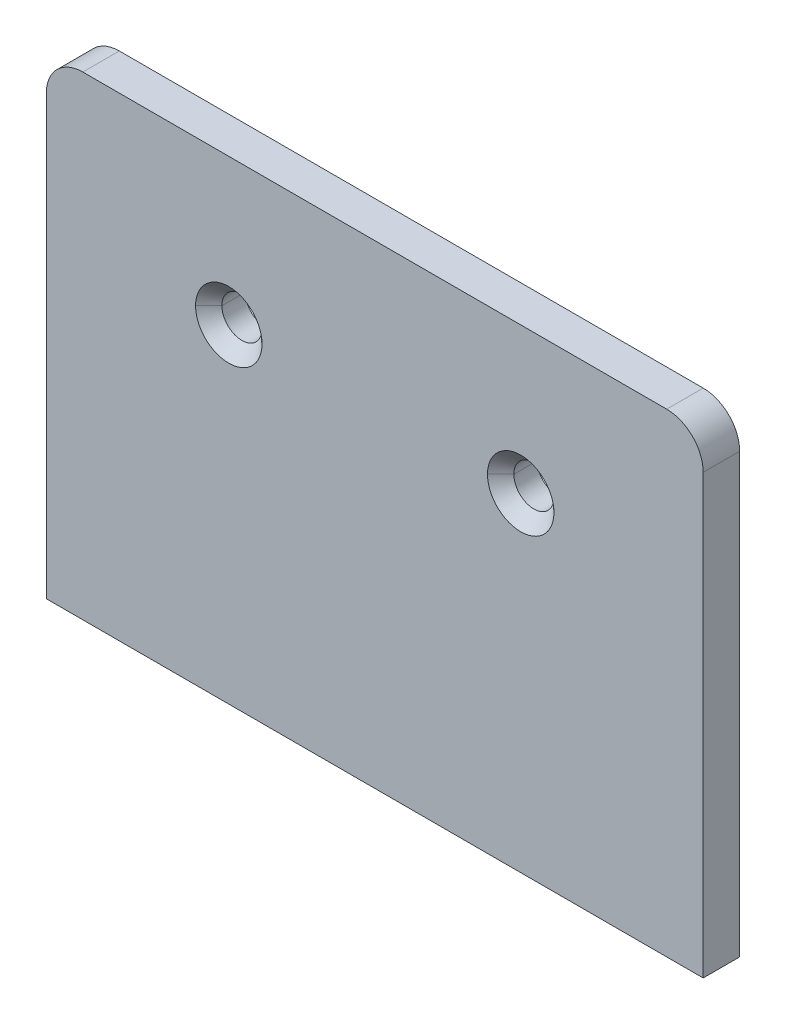
ISO-10303-21;
HEADER;
FILE_DESCRIPTION(('STEP AP214'),'2;1');
FILE_NAME('part.step','',(''),(''),'','','');
FILE_SCHEMA(('AUTOMOTIVE_DESIGN { 1 0 10303 214 1 1 1 1 }'));
ENDSEC;
DATA;
#1=APPLICATION_CONTEXT('core data for automotive mechanical design processes');
#2=APPLICATION_PROTOCOL_DEFINITION('international standard','automotive_design',2000,#1);
#3=PRODUCT_CONTEXT('',#1,'mechanical');
#4=PRODUCT('Part','Part','',(#3));
#5=PRODUCT_RELATED_PRODUCT_CATEGORY('part','',(#4));
#6=PRODUCT_DEFINITION_FORMATION('','',#4);
#7=PRODUCT_DEFINITION_CONTEXT('part definition',#1,'design');
#8=PRODUCT_DEFINITION('design','',#6,#7);
#9=PRODUCT_DEFINITION_SHAPE('','',#8);
#10=(LENGTH_UNIT() NAMED_UNIT(*) SI_UNIT(.MILLI.,.METRE.));
#11=(NAMED_UNIT(*) PLANE_ANGLE_UNIT() SI_UNIT($,.RADIAN.));
#12=(NAMED_UNIT(*) SI_UNIT($,.STERADIAN.) SOLID_ANGLE_UNIT());
#13=UNCERTAINTY_MEASURE_WITH_UNIT(LENGTH_MEASURE(1.E-05),#10,'distance_accuracy_value','');
#14=(GEOMETRIC_REPRESENTATION_CONTEXT(3) GLOBAL_UNCERTAINTY_ASSIGNED_CONTEXT((#13)) GLOBAL_UNIT_ASSIGNED_CONTEXT((#10,
#11,#12)) REPRESENTATION_CONTEXT('',''));
#15=CARTESIAN_POINT('',(0.,0.,0.));
#16=DIRECTION('',(0.,0.,1.));
#17=DIRECTION('',(1.,0.,0.));
#18=AXIS2_PLACEMENT_3D('',#15,#16,#17);
#19=CARTESIAN_POINT('',(20.,85.,0.));
#20=DIRECTION('',(0.,0.,1.));
#21=DIRECTION('',(1.,0.,0.));
#22=AXIS2_PLACEMENT_3D('',#19,#20,#21);
#23=CYLINDRICAL_SURFACE('',#22,2.75);
#24=DIRECTION('',(0.,0.,1.));
#25=VECTOR('',#24,1.);
#26=CARTESIAN_POINT('',(22.75,84.9999999995061,1.59895504));
#27=LINE('',#26,#25);
#28=CARTESIAN_POINT('',(22.75,84.9999999995061,3.19791008000002));
#29=VERTEX_POINT('',#28);
#30=CARTESIAN_POINT('',(22.75,84.9999999995061,0.));
#31=VERTEX_POINT('',#30);
#32=EDGE_CURVE('E89',#29,#31,#27,.F.);
#33=ORIENTED_EDGE('',*,*,#32,.F.);
#34=CARTESIAN_POINT('',(20.,85.,3.19791008000003));
#35=DIRECTION('',(0.,0.,1.));
#36=DIRECTION('',(1.,0.,0.));
#37=AXIS2_PLACEMENT_3D('',#34,#35,#36);
#38=CIRCLE('',#37,2.75);
#39=CARTESIAN_POINT('',(17.25,84.9999999988719,3.19791008000002));
#40=VERTEX_POINT('',#39);
#41=EDGE_CURVE('E113',#40,#29,#38,.F.);
#42=ORIENTED_EDGE('',*,*,#41,.F.);
#43=DIRECTION('',(0.,0.,-1.));
#44=VECTOR('',#43,1.);
#45=CARTESIAN_POINT('',(17.25,84.9999999988719,1.59895504));
#46=LINE('',#45,#44);
#47=CARTESIAN_POINT('',(17.25,84.9999999988719,0.));
#48=VERTEX_POINT('',#47);
#49=EDGE_CURVE('E96',#48,#40,#46,.F.);
#50=ORIENTED_EDGE('',*,*,#49,.F.);
#51=CARTESIAN_POINT('',(20.,85.,0.));
#52=DIRECTION('',(0.,0.,1.));
#53=DIRECTION('',(1.,0.,0.));
#54=AXIS2_PLACEMENT_3D('',#51,#52,#53);
#55=CIRCLE('',#54,2.75);
#56=EDGE_CURVE('E124',#48,#31,#55,.F.);
#57=ORIENTED_EDGE('',*,*,#56,.T.);
#58=EDGE_LOOP('',(#33,#42,#50,#57));
#59=FACE_BOUND('',#58,.T.);
#60=ADVANCED_FACE('F17',(#59),#23,.F.);
#61=CARTESIAN_POINT('',(20.,85.,0.));
#62=DIRECTION('',(0.,0.,1.));
#63=DIRECTION('',(1.,0.,0.));
#64=AXIS2_PLACEMENT_3D('',#61,#62,#63);
#65=CYLINDRICAL_SURFACE('',#64,2.75);
#66=CARTESIAN_POINT('',(20.,85.,3.19791008000003));
#67=DIRECTION('',(0.,0.,1.));
#68=DIRECTION('',(1.,0.,0.));
#69=AXIS2_PLACEMENT_3D('',#66,#67,#68);
#70=CIRCLE('',#69,2.75);
#71=EDGE_CURVE('E161',#29,#40,#70,.F.);
#72=ORIENTED_EDGE('',*,*,#71,.F.);
#73=ORIENTED_EDGE('',*,*,#32,.T.);
#74=CARTESIAN_POINT('',(20.,85.,0.));
#75=DIRECTION('',(0.,0.,1.));
#76=DIRECTION('',(1.,0.,0.));
#77=AXIS2_PLACEMENT_3D('',#74,#75,#76);
#78=CIRCLE('',#77,2.75);
#79=EDGE_CURVE('E21',#31,#48,#78,.F.);
#80=ORIENTED_EDGE('',*,*,#79,.T.);
#81=ORIENTED_EDGE('',*,*,#49,.T.);
#82=EDGE_LOOP('',(#72,#73,#80,#81));
#83=FACE_BOUND('',#82,.T.);
#84=ADVANCED_FACE('F194',(#83),#65,.F.);
#85=CARTESIAN_POINT('',(-45.,40.,0.));
#86=DIRECTION('',(0.,0.,1.));
#87=DIRECTION('',(1.,0.,0.));
#88=AXIS2_PLACEMENT_3D('',#85,#86,#87);
#89=PLANE('',#88);
#90=ORIENTED_EDGE('',*,*,#79,.F.);
#91=ORIENTED_EDGE('',*,*,#56,.F.);
#92=EDGE_LOOP('',(#90,#91));
#93=FACE_BOUND('',#92,.T.);
#94=CARTESIAN_POINT('',(-20.,85.,0.));
#95=DIRECTION('',(0.,0.,1.));
#96=DIRECTION('',(1.,0.,0.));
#97=AXIS2_PLACEMENT_3D('',#94,#95,#96);
#98=CIRCLE('',#97,2.75);
#99=CARTESIAN_POINT('',(-17.25,84.9999999995061,0.));
#100=VERTEX_POINT('',#99);
#101=CARTESIAN_POINT('',(-22.75,84.9999999988719,0.));
#102=VERTEX_POINT('',#101);
#103=EDGE_CURVE('E187',#100,#102,#98,.F.);
#104=ORIENTED_EDGE('',*,*,#103,.F.);
#105=CARTESIAN_POINT('',(-20.,85.,0.));
#106=DIRECTION('',(0.,0.,1.));
#107=DIRECTION('',(1.,0.,0.));
#108=AXIS2_PLACEMENT_3D('',#105,#106,#107);
#109=CIRCLE('',#108,2.75);
#110=EDGE_CURVE('E190',#102,#100,#109,.F.);
#111=ORIENTED_EDGE('',*,*,#110,.F.);
#112=EDGE_LOOP('',(#104,#111));
#113=FACE_BOUND('',#112,.T.);
#114=DIRECTION('',(0.,1.,0.));
#115=VECTOR('',#114,1.);
#116=CARTESIAN_POINT('',(-45.,70.,0.));
#117=LINE('',#116,#115);
#118=CARTESIAN_POINT('',(-45.,40.,0.));
#119=VERTEX_POINT('',#118);
#120=CARTESIAN_POINT('',(-45.,100.,0.));
#121=VERTEX_POINT('',#120);
#122=EDGE_CURVE('E120',#119,#121,#117,.T.);
#123=ORIENTED_EDGE('',*,*,#122,.T.);
#124=CARTESIAN_POINT('',(-40.,100.,0.));
#125=DIRECTION('',(0.,0.,-1.));
#126=DIRECTION('',(0.,1.,0.));
#127=AXIS2_PLACEMENT_3D('',#124,#125,#126);
#128=CIRCLE('',#127,5.);
#129=CARTESIAN_POINT('',(-39.9999999994873,105.,0.));
#130=VERTEX_POINT('',#129);
#131=EDGE_CURVE('E141',#121,#130,#128,.T.);
#132=ORIENTED_EDGE('',*,*,#131,.T.);
#133=DIRECTION('',(1.,0.,0.));
#134=VECTOR('',#133,1.);
#135=CARTESIAN_POINT('',(0.,105.,0.));
#136=LINE('',#135,#134);
#137=CARTESIAN_POINT('',(40.,105.,0.));
#138=VERTEX_POINT('',#137);
#139=EDGE_CURVE('E151',#130,#138,#136,.T.);
#140=ORIENTED_EDGE('',*,*,#139,.T.);
#141=CARTESIAN_POINT('',(40.,100.,0.));
#142=DIRECTION('',(0.,0.,-1.));
#143=DIRECTION('',(0.,1.,0.));
#144=AXIS2_PLACEMENT_3D('',#141,#142,#143);
#145=CIRCLE('',#144,5.);
#146=CARTESIAN_POINT('',(45.,99.9999999989745,0.));
#147=VERTEX_POINT('',#146);
#148=EDGE_CURVE('E155',#138,#147,#145,.T.);
#149=ORIENTED_EDGE('',*,*,#148,.T.);
#150=DIRECTION('',(0.,-1.,0.));
#151=VECTOR('',#150,1.);
#152=CARTESIAN_POINT('',(45.,70.,0.));
#153=LINE('',#152,#151);
#154=CARTESIAN_POINT('',(45.,40.,0.));
#155=VERTEX_POINT('',#154);
#156=EDGE_CURVE('E122',#147,#155,#153,.T.);
#157=ORIENTED_EDGE('',*,*,#156,.T.);
#158=DIRECTION('',(-1.,0.,0.));
#159=VECTOR('',#158,1.);
#160=CARTESIAN_POINT('',(0.,40.,0.));
#161=LINE('',#160,#159);
#162=EDGE_CURVE('E104',#155,#119,#161,.T.);
#163=ORIENTED_EDGE('',*,*,#162,.T.);
#164=EDGE_LOOP('',(#123,#132,#140,#149,#157,#163));
#165=FACE_BOUND('',#164,.T.);
#166=ADVANCED_FACE('F118',(#93,#113,#165),#89,.F.);
#167=CARTESIAN_POINT('',(-45.,40.,0.));
#168=DIRECTION('',(0.,1.,0.));
#169=DIRECTION('',(0.,0.,1.));
#170=AXIS2_PLACEMENT_3D('',#167,#168,#169);
#171=PLANE('',#170);
#172=DIRECTION('',(0.,0.,1.));
#173=VECTOR('',#172,1.);
#174=CARTESIAN_POINT('',(45.,40.,2.5));
#175=LINE('',#174,#173);
#176=CARTESIAN_POINT('',(45.,40.,5.));
#177=VERTEX_POINT('',#176);
#178=EDGE_CURVE('E123',#155,#177,#175,.T.);
#179=ORIENTED_EDGE('',*,*,#178,.T.);
#180=DIRECTION('',(1.,0.,0.));
#181=VECTOR('',#180,1.);
#182=CARTESIAN_POINT('',(0.,40.,5.));
#183=LINE('',#182,#181);
#184=CARTESIAN_POINT('',(-45.,40.,5.));
#185=VERTEX_POINT('',#184);
#186=EDGE_CURVE('E139',#185,#177,#183,.T.);
#187=ORIENTED_EDGE('',*,*,#186,.F.);
#188=DIRECTION('',(0.,0.,-1.));
#189=VECTOR('',#188,1.);
#190=CARTESIAN_POINT('',(-45.,40.,2.5));
#191=LINE('',#190,#189);
#192=EDGE_CURVE('E131',#185,#119,#191,.T.);
#193=ORIENTED_EDGE('',*,*,#192,.T.);
#194=ORIENTED_EDGE('',*,*,#162,.F.);
#195=EDGE_LOOP('',(#179,#187,#193,#194));
#196=FACE_BOUND('',#195,.T.);
#197=ADVANCED_FACE('F137',(#196),#171,.F.);
#198=CARTESIAN_POINT('',(45.,40.,0.));
#199=DIRECTION('',(-1.,0.,0.));
#200=DIRECTION('',(0.,0.,1.));
#201=AXIS2_PLACEMENT_3D('',#198,#199,#200);
#202=PLANE('',#201);
#203=DIRECTION('',(0.,0.,-1.));
#204=VECTOR('',#203,1.);
#205=CARTESIAN_POINT('',(45.,99.999999997949,2.5));
#206=LINE('',#205,#204);
#207=CARTESIAN_POINT('',(45.,99.9999999989745,5.));
#208=VERTEX_POINT('',#207);
#209=EDGE_CURVE('E156',#147,#208,#206,.F.);
#210=ORIENTED_EDGE('',*,*,#209,.T.);
#211=DIRECTION('',(0.,1.,0.));
#212=VECTOR('',#211,1.);
#213=CARTESIAN_POINT('',(45.,72.5,5.));
#214=LINE('',#213,#212);
#215=EDGE_CURVE('E146',#177,#208,#214,.T.);
#216=ORIENTED_EDGE('',*,*,#215,.F.);
#217=ORIENTED_EDGE('',*,*,#178,.F.);
#218=ORIENTED_EDGE('',*,*,#156,.F.);
#219=EDGE_LOOP('',(#210,#216,#217,#218));
#220=FACE_BOUND('',#219,.T.);
#221=ADVANCED_FACE('F265',(#220),#202,.F.);
#222=CARTESIAN_POINT('',(40.,100.,5.));
#223=DIRECTION('',(0.,0.,-1.));
#224=DIRECTION('',(0.,1.,0.));
#225=AXIS2_PLACEMENT_3D('',#222,#223,#224);
#226=CYLINDRICAL_SURFACE('',#225,5.);
#227=DIRECTION('',(0.,0.,1.));
#228=VECTOR('',#227,1.);
#229=CARTESIAN_POINT('',(40.,105.,2.5));
#230=LINE('',#229,#228);
#231=CARTESIAN_POINT('',(40.,105.,5.));
#232=VERTEX_POINT('',#231);
#233=EDGE_CURVE('E152',#138,#232,#230,.T.);
#234=ORIENTED_EDGE('',*,*,#233,.T.);
#235=CARTESIAN_POINT('',(40.,100.,5.));
#236=DIRECTION('',(0.,0.,-1.));
#237=DIRECTION('',(0.,1.,0.));
#238=AXIS2_PLACEMENT_3D('',#235,#236,#237);
#239=CIRCLE('',#238,5.);
#240=EDGE_CURVE('E185',#208,#232,#239,.F.);
#241=ORIENTED_EDGE('',*,*,#240,.F.);
#242=ORIENTED_EDGE('',*,*,#209,.F.);
#243=ORIENTED_EDGE('',*,*,#148,.F.);
#244=EDGE_LOOP('',(#234,#241,#242,#243));
#245=FACE_BOUND('',#244,.T.);
#246=ADVANCED_FACE('F262',(#245),#226,.T.);
#247=CARTESIAN_POINT('',(-40.,105.,5.));
#248=DIRECTION('',(0.,-1.,0.));
#249=DIRECTION('',(0.,0.,-1.));
#250=AXIS2_PLACEMENT_3D('',#247,#248,#249);
#251=PLANE('',#250);
#252=DIRECTION('',(0.,0.,-1.));
#253=VECTOR('',#252,1.);
#254=CARTESIAN_POINT('',(-39.9999999989745,105.,2.5));
#255=LINE('',#254,#253);
#256=CARTESIAN_POINT('',(-39.9999999994873,105.,5.));
#257=VERTEX_POINT('',#256);
#258=EDGE_CURVE('E148',#130,#257,#255,.F.);
#259=ORIENTED_EDGE('',*,*,#258,.T.);
#260=DIRECTION('',(-1.,0.,0.));
#261=VECTOR('',#260,1.);
#262=CARTESIAN_POINT('',(0.,105.,5.));
#263=LINE('',#262,#261);
#264=EDGE_CURVE('E184',#232,#257,#263,.T.);
#265=ORIENTED_EDGE('',*,*,#264,.F.);
#266=ORIENTED_EDGE('',*,*,#233,.F.);
#267=ORIENTED_EDGE('',*,*,#139,.F.);
#268=EDGE_LOOP('',(#259,#265,#266,#267));
#269=FACE_BOUND('',#268,.T.);
#270=ADVANCED_FACE('F261',(#269),#251,.F.);
#271=CARTESIAN_POINT('',(-40.,100.,5.));
#272=DIRECTION('',(0.,0.,-1.));
#273=DIRECTION('',(0.,1.,0.));
#274=AXIS2_PLACEMENT_3D('',#271,#272,#273);
#275=CYLINDRICAL_SURFACE('',#274,5.);
#276=DIRECTION('',(0.,0.,1.));
#277=VECTOR('',#276,1.);
#278=CARTESIAN_POINT('',(-45.,100.,2.5));
#279=LINE('',#278,#277);
#280=CARTESIAN_POINT('',(-45.,100.,5.));
#281=VERTEX_POINT('',#280);
#282=EDGE_CURVE('E134',#121,#281,#279,.T.);
#283=ORIENTED_EDGE('',*,*,#282,.T.);
#284=CARTESIAN_POINT('',(-40.,100.,5.));
#285=DIRECTION('',(0.,0.,-1.));
#286=DIRECTION('',(0.,1.,0.));
#287=AXIS2_PLACEMENT_3D('',#284,#285,#286);
#288=CIRCLE('',#287,5.);
#289=EDGE_CURVE('E182',#257,#281,#288,.F.);
#290=ORIENTED_EDGE('',*,*,#289,.F.);
#291=ORIENTED_EDGE('',*,*,#258,.F.);
#292=ORIENTED_EDGE('',*,*,#131,.F.);
#293=EDGE_LOOP('',(#283,#290,#291,#292));
#294=FACE_BOUND('',#293,.T.);
#295=ADVANCED_FACE('F231',(#294),#275,.T.);
#296=CARTESIAN_POINT('',(-45.,40.,5.));
#297=DIRECTION('',(1.,0.,0.));
#298=DIRECTION('',(0.,0.,-1.));
#299=AXIS2_PLACEMENT_3D('',#296,#297,#298);
#300=PLANE('',#299);
#301=ORIENTED_EDGE('',*,*,#192,.F.);
#302=DIRECTION('',(0.,-1.,0.));
#303=VECTOR('',#302,1.);
#304=CARTESIAN_POINT('',(-45.,72.5,5.));
#305=LINE('',#304,#303);
#306=EDGE_CURVE('E181',#281,#185,#305,.T.);
#307=ORIENTED_EDGE('',*,*,#306,.F.);
#308=ORIENTED_EDGE('',*,*,#282,.F.);
#309=ORIENTED_EDGE('',*,*,#122,.F.);
#310=EDGE_LOOP('',(#301,#307,#308,#309));
#311=FACE_BOUND('',#310,.T.);
#312=ADVANCED_FACE('F129',(#311),#300,.F.);
#313=CARTESIAN_POINT('',(20.,85.,3.19791008));
#314=DIRECTION('',(0.,0.,1.));
#315=DIRECTION('',(0.,-1.,0.));
#316=AXIS2_PLACEMENT_3D('',#313,#314,#315);
#317=CONICAL_SURFACE('',#316,2.75,0.785398163397449);
#318=DIRECTION('',(0.707106781186548,-1.26986435756302E-10,0.707106781186547));
#319=VECTOR('',#318,1.);
#320=CARTESIAN_POINT('',(23.65104496,84.9999999993443,4.09895504));
#321=LINE('',#320,#319);
#322=CARTESIAN_POINT('',(24.55208992,84.9999999995913,5.));
#323=VERTEX_POINT('',#322);
#324=EDGE_CURVE('E192',#323,#29,#321,.F.);
#325=ORIENTED_EDGE('',*,*,#324,.F.);
#326=CARTESIAN_POINT('',(20.,85.,5.));
#327=DIRECTION('',(0.,0.,1.));
#328=DIRECTION('',(0.,-1.,0.));
#329=AXIS2_PLACEMENT_3D('',#326,#327,#328);
#330=CIRCLE('',#329,4.55208992000001);
#331=CARTESIAN_POINT('',(15.44791008,84.9999999981327,5.));
#332=VERTEX_POINT('',#331);
#333=EDGE_CURVE('E179',#332,#323,#330,.F.);
#334=ORIENTED_EDGE('',*,*,#333,.F.);
#335=DIRECTION('',(0.707106781186548,2.90059454263763E-10,-0.707106781186547));
#336=VECTOR('',#335,1.);
#337=CARTESIAN_POINT('',(16.34895504,84.9999999985023,4.09895504));
#338=LINE('',#337,#336);
#339=EDGE_CURVE('E164',#40,#332,#338,.F.);
#340=ORIENTED_EDGE('',*,*,#339,.F.);
#341=ORIENTED_EDGE('',*,*,#41,.T.);
#342=EDGE_LOOP('',(#325,#334,#340,#341));
#343=FACE_BOUND('',#342,.T.);
#344=ADVANCED_FACE('F220',(#343),#317,.F.);
#345=CARTESIAN_POINT('',(20.,85.,3.19791008));
#346=DIRECTION('',(0.,0.,1.));
#347=DIRECTION('',(0.,-1.,0.));
#348=AXIS2_PLACEMENT_3D('',#345,#346,#347);
#349=CONICAL_SURFACE('',#348,2.75,0.785398163397449);
#350=CARTESIAN_POINT('',(20.,85.,5.));
#351=DIRECTION('',(0.,0.,1.));
#352=DIRECTION('',(0.,-1.,0.));
#353=AXIS2_PLACEMENT_3D('',#350,#351,#352);
#354=CIRCLE('',#353,4.55208992000001);
#355=EDGE_CURVE('E176',#323,#332,#354,.F.);
#356=ORIENTED_EDGE('',*,*,#355,.F.);
#357=ORIENTED_EDGE('',*,*,#324,.T.);
#358=ORIENTED_EDGE('',*,*,#71,.T.);
#359=ORIENTED_EDGE('',*,*,#339,.T.);
#360=EDGE_LOOP('',(#356,#357,#358,#359));
#361=FACE_BOUND('',#360,.T.);
#362=ADVANCED_FACE('F218',(#361),#349,.F.);
#363=CARTESIAN_POINT('',(-20.,85.,0.));
#364=DIRECTION('',(0.,0.,1.));
#365=DIRECTION('',(1.,0.,0.));
#366=AXIS2_PLACEMENT_3D('',#363,#364,#365);
#367=CYLINDRICAL_SURFACE('',#366,2.75);
#368=DIRECTION('',(0.,0.,1.));
#369=VECTOR('',#368,1.);
#370=CARTESIAN_POINT('',(-17.25,84.9999999995061,1.59895504));
#371=LINE('',#370,#369);
#372=CARTESIAN_POINT('',(-17.25,84.9999999996296,3.19791008000003));
#373=VERTEX_POINT('',#372);
#374=EDGE_CURVE('E147',#373,#100,#371,.F.);
#375=ORIENTED_EDGE('',*,*,#374,.F.);
#376=CARTESIAN_POINT('',(-20.,85.,3.19791008000003));
#377=DIRECTION('',(0.,0.,1.));
#378=DIRECTION('',(1.,0.,0.));
#379=AXIS2_PLACEMENT_3D('',#376,#377,#378);
#380=CIRCLE('',#379,2.75);
#381=CARTESIAN_POINT('',(-22.75,84.9999999988719,3.19791008000002));
#382=VERTEX_POINT('',#381);
#383=EDGE_CURVE('E175',#382,#373,#380,.F.);
#384=ORIENTED_EDGE('',*,*,#383,.F.);
#385=DIRECTION('',(0.,0.,-1.));
#386=VECTOR('',#385,1.);
#387=CARTESIAN_POINT('',(-22.75,84.9999999988719,1.59895504));
#388=LINE('',#387,#386);
#389=EDGE_CURVE('E189',#102,#382,#388,.F.);
#390=ORIENTED_EDGE('',*,*,#389,.F.);
#391=ORIENTED_EDGE('',*,*,#110,.T.);
#392=EDGE_LOOP('',(#375,#384,#390,#391));
#393=FACE_BOUND('',#392,.T.);
#394=ADVANCED_FACE('F241',(#393),#367,.F.);
#395=CARTESIAN_POINT('',(-20.,85.,0.));
#396=DIRECTION('',(0.,0.,1.));
#397=DIRECTION('',(1.,0.,0.));
#398=AXIS2_PLACEMENT_3D('',#395,#396,#397);
#399=CYLINDRICAL_SURFACE('',#398,2.75);
#400=CARTESIAN_POINT('',(-20.,85.,3.19791008000003));
#401=DIRECTION('',(0.,0.,1.));
#402=DIRECTION('',(1.,0.,0.));
#403=AXIS2_PLACEMENT_3D('',#400,#401,#402);
#404=CIRCLE('',#403,2.75);
#405=EDGE_CURVE('E174',#373,#382,#404,.F.);
#406=ORIENTED_EDGE('',*,*,#405,.F.);
#407=ORIENTED_EDGE('',*,*,#374,.T.);
#408=ORIENTED_EDGE('',*,*,#103,.T.);
#409=ORIENTED_EDGE('',*,*,#389,.T.);
#410=EDGE_LOOP('',(#406,#407,#408,#409));
#411=FACE_BOUND('',#410,.T.);
#412=ADVANCED_FACE('F206',(#411),#399,.F.);
#413=CARTESIAN_POINT('',(-45.,40.,5.));
#414=DIRECTION('',(0.,0.,1.));
#415=DIRECTION('',(1.,0.,0.));
#416=AXIS2_PLACEMENT_3D('',#413,#414,#415);
#417=PLANE('',#416);
#418=ORIENTED_EDGE('',*,*,#333,.T.);
#419=ORIENTED_EDGE('',*,*,#355,.T.);
#420=EDGE_LOOP('',(#418,#419));
#421=FACE_BOUND('',#420,.T.);
#422=CARTESIAN_POINT('',(-20.,85.,5.));
#423=DIRECTION('',(0.,0.,1.));
#424=DIRECTION('',(0.,-1.,0.));
#425=AXIS2_PLACEMENT_3D('',#422,#423,#424);
#426=CIRCLE('',#425,4.55208992);
#427=CARTESIAN_POINT('',(-15.44791008,84.9999999993869,5.));
#428=VERTEX_POINT('',#427);
#429=CARTESIAN_POINT('',(-24.55208992,84.9999999981327,5.));
#430=VERTEX_POINT('',#429);
#431=EDGE_CURVE('E172',#428,#430,#426,.T.);
#432=ORIENTED_EDGE('',*,*,#431,.F.);
#433=CARTESIAN_POINT('',(-20.,85.,5.));
#434=DIRECTION('',(0.,0.,1.));
#435=DIRECTION('',(0.,-1.,0.));
#436=AXIS2_PLACEMENT_3D('',#433,#434,#435);
#437=CIRCLE('',#436,4.55208992000001);
#438=EDGE_CURVE('E27',#430,#428,#437,.T.);
#439=ORIENTED_EDGE('',*,*,#438,.F.);
#440=EDGE_LOOP('',(#432,#439));
#441=FACE_BOUND('',#440,.T.);
#442=ORIENTED_EDGE('',*,*,#289,.T.);
#443=ORIENTED_EDGE('',*,*,#306,.T.);
#444=ORIENTED_EDGE('',*,*,#186,.T.);
#445=ORIENTED_EDGE('',*,*,#215,.T.);
#446=ORIENTED_EDGE('',*,*,#240,.T.);
#447=ORIENTED_EDGE('',*,*,#264,.T.);
#448=EDGE_LOOP('',(#442,#443,#444,#445,#446,#447));
#449=FACE_BOUND('',#448,.T.);
#450=ADVANCED_FACE('F19',(#421,#441,#449),#417,.T.);
#451=CARTESIAN_POINT('',(-20.,85.,3.19791008));
#452=DIRECTION('',(0.,0.,1.));
#453=DIRECTION('',(0.,-1.,0.));
#454=AXIS2_PLACEMENT_3D('',#451,#452,#453);
#455=CONICAL_SURFACE('',#454,2.75,0.785398163397449);
#456=DIRECTION('',(0.707106781186548,-1.26986435756302E-10,0.707106781186547));
#457=VECTOR('',#456,1.);
#458=CARTESIAN_POINT('',(-16.34895504,84.9999999993443,4.09895504));
#459=LINE('',#458,#457);
#460=EDGE_CURVE('E11',#428,#373,#459,.F.);
#461=ORIENTED_EDGE('',*,*,#460,.F.);
#462=ORIENTED_EDGE('',*,*,#431,.T.);
#463=DIRECTION('',(0.707106781186548,2.90059454263763E-10,-0.707106781186547));
#464=VECTOR('',#463,1.);
#465=CARTESIAN_POINT('',(-23.65104496,84.9999999985023,4.09895504));
#466=LINE('',#465,#464);
#467=EDGE_CURVE('E171',#382,#430,#466,.F.);
#468=ORIENTED_EDGE('',*,*,#467,.F.);
#469=ORIENTED_EDGE('',*,*,#383,.T.);
#470=EDGE_LOOP('',(#461,#462,#468,#469));
#471=FACE_BOUND('',#470,.T.);
#472=ADVANCED_FACE('F224',(#471),#455,.F.);
#473=CARTESIAN_POINT('',(-20.,85.,3.19791008));
#474=DIRECTION('',(0.,0.,1.));
#475=DIRECTION('',(0.,-1.,0.));
#476=AXIS2_PLACEMENT_3D('',#473,#474,#475);
#477=CONICAL_SURFACE('',#476,2.75,0.785398163397449);
#478=ORIENTED_EDGE('',*,*,#438,.T.);
#479=ORIENTED_EDGE('',*,*,#460,.T.);
#480=ORIENTED_EDGE('',*,*,#405,.T.);
#481=ORIENTED_EDGE('',*,*,#467,.T.);
#482=EDGE_LOOP('',(#478,#479,#480,#481));
#483=FACE_BOUND('',#482,.T.);
#484=ADVANCED_FACE('F238',(#483),#477,.F.);
#485=CLOSED_SHELL('',(#60,#84,#166,#197,#221,#246,#270,#295,#312,#344,#362,#394,#412,#450,#472,#484));
#486=MANIFOLD_SOLID_BREP('B1',#485);
#487=ADVANCED_BREP_SHAPE_REPRESENTATION('',(#18,#486),#14);
#488=SHAPE_DEFINITION_REPRESENTATION(#9,#487);
ENDSEC;
END-ISO-10303-21;
